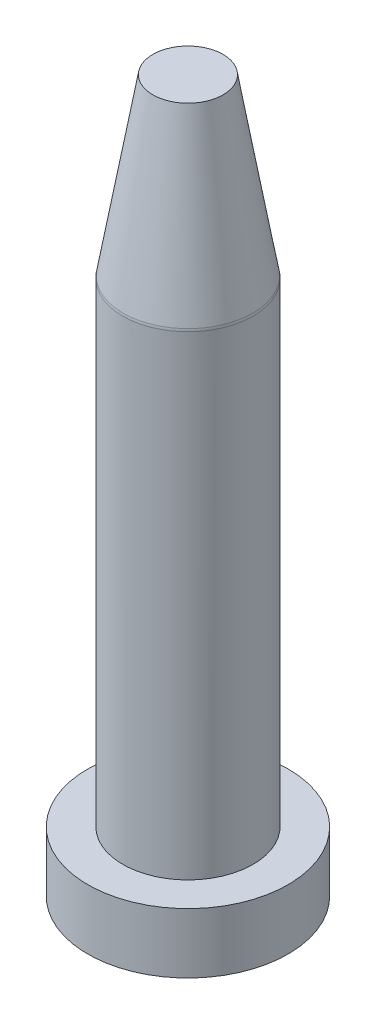
ISO-10303-21;
HEADER;
FILE_DESCRIPTION(('STEP AP214'),'2;1');
FILE_NAME('part.step','',(''),(''),'','','');
FILE_SCHEMA(('AUTOMOTIVE_DESIGN { 1 0 10303 214 1 1 1 1 }'));
ENDSEC;
DATA;
#1=APPLICATION_CONTEXT('core data for automotive mechanical design processes');
#2=APPLICATION_PROTOCOL_DEFINITION('international standard','automotive_design',2000,#1);
#3=PRODUCT_CONTEXT('',#1,'mechanical');
#4=PRODUCT('Part','Part','',(#3));
#5=PRODUCT_RELATED_PRODUCT_CATEGORY('part','',(#4));
#6=PRODUCT_DEFINITION_FORMATION('','',#4);
#7=PRODUCT_DEFINITION_CONTEXT('part definition',#1,'design');
#8=PRODUCT_DEFINITION('design','',#6,#7);
#9=PRODUCT_DEFINITION_SHAPE('','',#8);
#10=(LENGTH_UNIT() NAMED_UNIT(*) SI_UNIT(.MILLI.,.METRE.));
#11=(NAMED_UNIT(*) PLANE_ANGLE_UNIT() SI_UNIT($,.RADIAN.));
#12=(NAMED_UNIT(*) SI_UNIT($,.STERADIAN.) SOLID_ANGLE_UNIT());
#13=UNCERTAINTY_MEASURE_WITH_UNIT(LENGTH_MEASURE(1.E-05),#10,'distance_accuracy_value','');
#14=(GEOMETRIC_REPRESENTATION_CONTEXT(3) GLOBAL_UNCERTAINTY_ASSIGNED_CONTEXT((#13)) GLOBAL_UNIT_ASSIGNED_CONTEXT((#10,
#11,#12)) REPRESENTATION_CONTEXT('',''));
#15=CARTESIAN_POINT('',(0.,0.,0.));
#16=DIRECTION('',(0.,0.,1.));
#17=DIRECTION('',(1.,0.,0.));
#18=AXIS2_PLACEMENT_3D('',#15,#16,#17);
#19=CARTESIAN_POINT('',(0.,142.,0.));
#20=DIRECTION('',(0.,1.,0.));
#21=DIRECTION('',(0.,0.,1.));
#22=AXIS2_PLACEMENT_3D('',#19,#20,#21);
#23=PLANE('',#22);
#24=CARTESIAN_POINT('',(0.,142.,0.));
#25=DIRECTION('',(0.,-1.,0.));
#26=DIRECTION('',(0.,0.,-1.));
#27=AXIS2_PLACEMENT_3D('',#24,#25,#26);
#28=CIRCLE('',#27,7.);
#29=CARTESIAN_POINT('',(0.,142.,-7.));
#30=VERTEX_POINT('',#29);
#31=EDGE_CURVE('E41',#30,#30,#28,.T.);
#32=ORIENTED_EDGE('',*,*,#31,.F.);
#33=EDGE_LOOP('',(#32));
#34=FACE_BOUND('',#33,.T.);
#35=ADVANCED_FACE('F30',(#34),#23,.T.);
#36=CARTESIAN_POINT('',(0.,107.,0.));
#37=DIRECTION('',(0.,-1.,0.));
#38=DIRECTION('',(0.,0.,-1.));
#39=AXIS2_PLACEMENT_3D('',#36,#37,#38);
#40=CONICAL_SURFACE('',#39,13.,0.169778273968338);
#41=CARTESIAN_POINT('',(0.,107.251610540768,0.));
#42=DIRECTION('',(0.,1.,0.));
#43=DIRECTION('',(0.,0.,1.));
#44=AXIS2_PLACEMENT_3D('',#41,#42,#43);
#45=CIRCLE('',#44,12.9568667644398);
#46=CARTESIAN_POINT('',(0.,107.251610540768,12.9568667644398));
#47=VERTEX_POINT('',#46);
#48=EDGE_CURVE('E10',#47,#47,#45,.T.);
#49=ORIENTED_EDGE('',*,*,#48,.T.);
#50=EDGE_LOOP('',(#49));
#51=FACE_BOUND('',#50,.T.);
#52=ORIENTED_EDGE('',*,*,#31,.T.);
#53=EDGE_LOOP('',(#52));
#54=FACE_BOUND('',#53,.T.);
#55=ADVANCED_FACE('F73',(#51,#54),#40,.T.);
#56=CARTESIAN_POINT('',(0.,0.,0.));
#57=DIRECTION('',(0.,-1.,0.));
#58=DIRECTION('',(0.,0.,-1.));
#59=AXIS2_PLACEMENT_3D('',#56,#57,#58);
#60=CYLINDRICAL_SURFACE('',#59,13.);
#61=CARTESIAN_POINT('',(0.,106.744719095435,0.));
#62=DIRECTION('',(0.,1.,0.));
#63=DIRECTION('',(0.,0.,1.));
#64=AXIS2_PLACEMENT_3D('',#61,#62,#63);
#65=CIRCLE('',#64,13.);
#66=CARTESIAN_POINT('',(0.,106.744719095435,13.));
#67=VERTEX_POINT('',#66);
#68=EDGE_CURVE('E37',#67,#67,#65,.F.);
#69=ORIENTED_EDGE('',*,*,#68,.T.);
#70=EDGE_LOOP('',(#69));
#71=FACE_BOUND('',#70,.T.);
#72=CARTESIAN_POINT('',(0.,12.,0.));
#73=DIRECTION('',(0.,-1.,0.));
#74=DIRECTION('',(0.,0.,-1.));
#75=AXIS2_PLACEMENT_3D('',#72,#73,#74);
#76=CIRCLE('',#75,13.);
#77=CARTESIAN_POINT('',(0.,12.,-13.));
#78=VERTEX_POINT('',#77);
#79=EDGE_CURVE('E45',#78,#78,#76,.T.);
#80=ORIENTED_EDGE('',*,*,#79,.F.);
#81=EDGE_LOOP('',(#80));
#82=FACE_BOUND('',#81,.T.);
#83=ADVANCED_FACE('F69',(#71,#82),#60,.T.);
#84=CARTESIAN_POINT('',(20.,12.,0.));
#85=DIRECTION('',(0.,1.,0.));
#86=DIRECTION('',(0.,0.,1.));
#87=AXIS2_PLACEMENT_3D('',#84,#85,#86);
#88=PLANE('',#87);
#89=ORIENTED_EDGE('',*,*,#79,.T.);
#90=EDGE_LOOP('',(#89));
#91=FACE_BOUND('',#90,.T.);
#92=CARTESIAN_POINT('',(0.,12.,0.));
#93=DIRECTION('',(0.,-1.,0.));
#94=DIRECTION('',(0.,0.,-1.));
#95=AXIS2_PLACEMENT_3D('',#92,#93,#94);
#96=CIRCLE('',#95,20.);
#97=CARTESIAN_POINT('',(0.,12.,-20.));
#98=VERTEX_POINT('',#97);
#99=EDGE_CURVE('E50',#98,#98,#96,.T.);
#100=ORIENTED_EDGE('',*,*,#99,.F.);
#101=EDGE_LOOP('',(#100));
#102=FACE_BOUND('',#101,.T.);
#103=ADVANCED_FACE('F61',(#91,#102),#88,.T.);
#104=CARTESIAN_POINT('',(0.,0.,0.));
#105=DIRECTION('',(0.,-1.,0.));
#106=DIRECTION('',(0.,0.,-1.));
#107=AXIS2_PLACEMENT_3D('',#104,#105,#106);
#108=CYLINDRICAL_SURFACE('',#107,20.);
#109=ORIENTED_EDGE('',*,*,#99,.T.);
#110=EDGE_LOOP('',(#109));
#111=FACE_BOUND('',#110,.T.);
#112=CARTESIAN_POINT('',(0.,0.,0.));
#113=DIRECTION('',(0.,-1.,0.));
#114=DIRECTION('',(0.,0.,-1.));
#115=AXIS2_PLACEMENT_3D('',#112,#113,#114);
#116=CIRCLE('',#115,20.);
#117=CARTESIAN_POINT('',(0.,0.,-20.));
#118=VERTEX_POINT('',#117);
#119=EDGE_CURVE('E53',#118,#118,#116,.T.);
#120=ORIENTED_EDGE('',*,*,#119,.F.);
#121=EDGE_LOOP('',(#120));
#122=FACE_BOUND('',#121,.T.);
#123=ADVANCED_FACE('F59',(#111,#122),#108,.T.);
#124=CARTESIAN_POINT('',(0.,0.,0.));
#125=DIRECTION('',(0.,-1.,0.));
#126=DIRECTION('',(0.,0.,-1.));
#127=AXIS2_PLACEMENT_3D('',#124,#125,#126);
#128=PLANE('',#127);
#129=ORIENTED_EDGE('',*,*,#119,.T.);
#130=EDGE_LOOP('',(#129));
#131=FACE_BOUND('',#130,.T.);
#132=ADVANCED_FACE('F57',(#131),#128,.T.);
#133=CARTESIAN_POINT('',(0.,106.744719095435,0.));
#134=DIRECTION('',(0.,1.,0.));
#135=DIRECTION('',(0.,0.,1.));
#136=AXIS2_PLACEMENT_3D('',#133,#134,#135);
#137=TOROIDAL_SURFACE('',#136,10.,3.);
#138=ORIENTED_EDGE('',*,*,#48,.F.);
#139=EDGE_LOOP('',(#138));
#140=FACE_BOUND('',#139,.T.);
#141=ORIENTED_EDGE('',*,*,#68,.F.);
#142=EDGE_LOOP('',(#141));
#143=FACE_BOUND('',#142,.T.);
#144=ADVANCED_FACE('F32',(#140,#143),#137,.T.);
#145=CLOSED_SHELL('',(#35,#55,#83,#103,#123,#132,#144));
#146=MANIFOLD_SOLID_BREP('B2',#145);
#147=ADVANCED_BREP_SHAPE_REPRESENTATION('',(#18,#146),#14);
#148=SHAPE_DEFINITION_REPRESENTATION(#9,#147);
ENDSEC;
END-ISO-10303-21;
